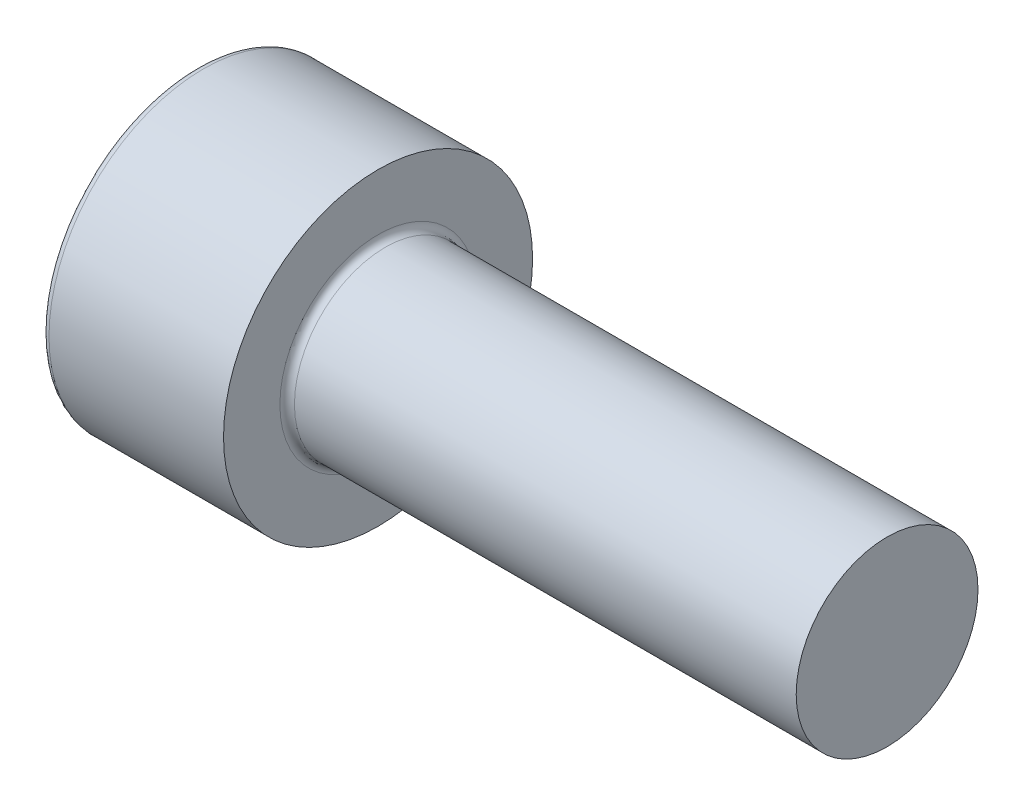
ISO-10303-21;
HEADER;
FILE_DESCRIPTION(('STEP AP214'),'2;1');
FILE_NAME('part.step','',(''),(''),'','','');
FILE_SCHEMA(('AUTOMOTIVE_DESIGN { 1 0 10303 214 1 1 1 1 }'));
ENDSEC;
DATA;
#1=APPLICATION_CONTEXT('core data for automotive mechanical design processes');
#2=APPLICATION_PROTOCOL_DEFINITION('international standard','automotive_design',2000,#1);
#3=PRODUCT_CONTEXT('',#1,'mechanical');
#4=PRODUCT('Part','Part','',(#3));
#5=PRODUCT_RELATED_PRODUCT_CATEGORY('part','',(#4));
#6=PRODUCT_DEFINITION_FORMATION('','',#4);
#7=PRODUCT_DEFINITION_CONTEXT('part definition',#1,'design');
#8=PRODUCT_DEFINITION('design','',#6,#7);
#9=PRODUCT_DEFINITION_SHAPE('','',#8);
#10=(LENGTH_UNIT() NAMED_UNIT(*) SI_UNIT(.MILLI.,.METRE.));
#11=(NAMED_UNIT(*) PLANE_ANGLE_UNIT() SI_UNIT($,.RADIAN.));
#12=(NAMED_UNIT(*) SI_UNIT($,.STERADIAN.) SOLID_ANGLE_UNIT());
#13=UNCERTAINTY_MEASURE_WITH_UNIT(LENGTH_MEASURE(1.E-05),#10,'distance_accuracy_value','');
#14=(GEOMETRIC_REPRESENTATION_CONTEXT(3) GLOBAL_UNCERTAINTY_ASSIGNED_CONTEXT((#13)) GLOBAL_UNIT_ASSIGNED_CONTEXT((#10,
#11,#12)) REPRESENTATION_CONTEXT('',''));
#15=CARTESIAN_POINT('',(0.,0.,0.));
#16=DIRECTION('',(0.,0.,1.));
#17=DIRECTION('',(1.,0.,0.));
#18=AXIS2_PLACEMENT_3D('',#15,#16,#17);
#19=CARTESIAN_POINT('',(0.,0.,0.));
#20=DIRECTION('',(1.,0.,0.));
#21=DIRECTION('',(0.,0.,-1.));
#22=AXIS2_PLACEMENT_3D('',#19,#20,#21);
#23=CYLINDRICAL_SURFACE('',#22,2.5);
#24=CARTESIAN_POINT('',(5.2,0.,0.));
#25=DIRECTION('',(1.,0.,0.));
#26=DIRECTION('',(0.,0.,-1.));
#27=AXIS2_PLACEMENT_3D('',#24,#25,#26);
#28=CIRCLE('',#27,2.5);
#29=CARTESIAN_POINT('',(5.2,0.,-2.5));
#30=VERTEX_POINT('',#29);
#31=EDGE_CURVE('E148',#30,#30,#28,.T.);
#32=ORIENTED_EDGE('',*,*,#31,.T.);
#33=EDGE_LOOP('',(#32));
#34=FACE_BOUND('',#33,.T.);
#35=CARTESIAN_POINT('',(19.,0.,0.));
#36=DIRECTION('',(1.,0.,0.));
#37=DIRECTION('',(0.,0.,-1.));
#38=AXIS2_PLACEMENT_3D('',#35,#36,#37);
#39=CIRCLE('',#38,2.5);
#40=CARTESIAN_POINT('',(19.,0.,-2.5));
#41=VERTEX_POINT('',#40);
#42=EDGE_CURVE('E49',#41,#41,#39,.F.);
#43=ORIENTED_EDGE('',*,*,#42,.T.);
#44=EDGE_LOOP('',(#43));
#45=FACE_BOUND('',#44,.T.);
#46=ADVANCED_FACE('F45',(#34,#45),#23,.T.);
#47=CARTESIAN_POINT('',(0.,0.,0.));
#48=DIRECTION('',(-1.,0.,0.));
#49=DIRECTION('',(0.,0.,1.));
#50=AXIS2_PLACEMENT_3D('',#47,#48,#49);
#51=PLANE('',#50);
#52=CARTESIAN_POINT('',(0.,0.,0.));
#53=DIRECTION('',(-1.,0.,0.));
#54=DIRECTION('',(0.,0.,1.));
#55=AXIS2_PLACEMENT_3D('',#52,#53,#54);
#56=CIRCLE('',#55,4.05);
#57=CARTESIAN_POINT('',(0.,0.,4.05));
#58=VERTEX_POINT('',#57);
#59=EDGE_CURVE('E11',#58,#58,#56,.T.);
#60=ORIENTED_EDGE('',*,*,#59,.T.);
#61=EDGE_LOOP('',(#60));
#62=FACE_BOUND('',#61,.T.);
#63=DIRECTION('',(0.,0.5,0.866025403784439));
#64=VECTOR('',#63,1.);
#65=CARTESIAN_POINT('',(0.,-2.29,0.));
#66=LINE('',#65,#64);
#67=CARTESIAN_POINT('',(0.,-2.29,0.));
#68=VERTEX_POINT('',#67);
#69=CARTESIAN_POINT('',(0.,-1.145,1.98319817466636));
#70=VERTEX_POINT('',#69);
#71=EDGE_CURVE('E61',#68,#70,#66,.T.);
#72=ORIENTED_EDGE('',*,*,#71,.F.);
#73=DIRECTION('',(0.,-0.5,0.866025403784439));
#74=VECTOR('',#73,1.);
#75=CARTESIAN_POINT('',(0.,-1.145,-1.98319817466636));
#76=LINE('',#75,#74);
#77=CARTESIAN_POINT('',(0.,-1.145,-1.98319817466636));
#78=VERTEX_POINT('',#77);
#79=EDGE_CURVE('E144',#78,#68,#76,.T.);
#80=ORIENTED_EDGE('',*,*,#79,.F.);
#81=DIRECTION('',(0.,-1.,0.));
#82=VECTOR('',#81,1.);
#83=CARTESIAN_POINT('',(0.,1.145,-1.98319817466636));
#84=LINE('',#83,#82);
#85=CARTESIAN_POINT('',(0.,1.145,-1.98319817466636));
#86=VERTEX_POINT('',#85);
#87=EDGE_CURVE('E142',#86,#78,#84,.T.);
#88=ORIENTED_EDGE('',*,*,#87,.F.);
#89=DIRECTION('',(0.,-0.5,-0.866025403784439));
#90=VECTOR('',#89,1.);
#91=CARTESIAN_POINT('',(0.,2.29,0.));
#92=LINE('',#91,#90);
#93=CARTESIAN_POINT('',(0.,2.29,0.));
#94=VERTEX_POINT('',#93);
#95=EDGE_CURVE('E109',#94,#86,#92,.T.);
#96=ORIENTED_EDGE('',*,*,#95,.F.);
#97=DIRECTION('',(0.,0.5,-0.866025403784439));
#98=VECTOR('',#97,1.);
#99=CARTESIAN_POINT('',(0.,1.145,1.98319817466636));
#100=LINE('',#99,#98);
#101=CARTESIAN_POINT('',(0.,1.145,1.98319817466636));
#102=VERTEX_POINT('',#101);
#103=EDGE_CURVE('E138',#102,#94,#100,.T.);
#104=ORIENTED_EDGE('',*,*,#103,.F.);
#105=DIRECTION('',(0.,1.,0.));
#106=VECTOR('',#105,1.);
#107=CARTESIAN_POINT('',(0.,-1.145,1.98319817466636));
#108=LINE('',#107,#106);
#109=EDGE_CURVE('E135',#70,#102,#108,.T.);
#110=ORIENTED_EDGE('',*,*,#109,.F.);
#111=EDGE_LOOP('',(#72,#80,#88,#96,#104,#110));
#112=FACE_BOUND('',#111,.T.);
#113=ADVANCED_FACE('F183',(#62,#112),#51,.T.);
#114=CARTESIAN_POINT('',(0.,0.,0.));
#115=DIRECTION('',(1.,0.,0.));
#116=DIRECTION('',(0.,0.,-1.));
#117=AXIS2_PLACEMENT_3D('',#114,#115,#116);
#118=CYLINDRICAL_SURFACE('',#117,4.25);
#119=CARTESIAN_POINT('',(0.2,0.,0.));
#120=DIRECTION('',(-1.,0.,0.));
#121=DIRECTION('',(0.,0.,1.));
#122=AXIS2_PLACEMENT_3D('',#119,#120,#121);
#123=CIRCLE('',#122,4.25);
#124=CARTESIAN_POINT('',(0.2,0.,4.25));
#125=VERTEX_POINT('',#124);
#126=EDGE_CURVE('E54',#125,#125,#123,.F.);
#127=ORIENTED_EDGE('',*,*,#126,.T.);
#128=EDGE_LOOP('',(#127));
#129=FACE_BOUND('',#128,.T.);
#130=CARTESIAN_POINT('',(5.,0.,0.));
#131=DIRECTION('',(1.,0.,0.));
#132=DIRECTION('',(0.,0.,-1.));
#133=AXIS2_PLACEMENT_3D('',#130,#131,#132);
#134=CIRCLE('',#133,4.25);
#135=CARTESIAN_POINT('',(5.,0.,-4.25));
#136=VERTEX_POINT('',#135);
#137=EDGE_CURVE('E159',#136,#136,#134,.T.);
#138=ORIENTED_EDGE('',*,*,#137,.F.);
#139=EDGE_LOOP('',(#138));
#140=FACE_BOUND('',#139,.T.);
#141=ADVANCED_FACE('F166',(#129,#140),#118,.T.);
#142=CARTESIAN_POINT('',(5.,4.25,0.));
#143=DIRECTION('',(1.,0.,0.));
#144=DIRECTION('',(0.,0.,-1.));
#145=AXIS2_PLACEMENT_3D('',#142,#143,#144);
#146=PLANE('',#145);
#147=ORIENTED_EDGE('',*,*,#137,.T.);
#148=EDGE_LOOP('',(#147));
#149=FACE_BOUND('',#148,.T.);
#150=CARTESIAN_POINT('',(5.,0.,0.));
#151=DIRECTION('',(1.,0.,0.));
#152=DIRECTION('',(0.,0.,-1.));
#153=AXIS2_PLACEMENT_3D('',#150,#151,#152);
#154=CIRCLE('',#153,2.7);
#155=CARTESIAN_POINT('',(5.,0.,-2.7));
#156=VERTEX_POINT('',#155);
#157=EDGE_CURVE('E156',#156,#156,#154,.T.);
#158=ORIENTED_EDGE('',*,*,#157,.F.);
#159=EDGE_LOOP('',(#158));
#160=FACE_BOUND('',#159,.T.);
#161=ADVANCED_FACE('F198',(#149,#160),#146,.T.);
#162=CARTESIAN_POINT('',(5.2,0.,0.));
#163=DIRECTION('',(1.,0.,0.));
#164=DIRECTION('',(0.,0.,-1.));
#165=AXIS2_PLACEMENT_3D('',#162,#163,#164);
#166=TOROIDAL_SURFACE('',#165,2.7,0.2);
#167=ORIENTED_EDGE('',*,*,#157,.T.);
#168=EDGE_LOOP('',(#167));
#169=FACE_BOUND('',#168,.T.);
#170=ORIENTED_EDGE('',*,*,#31,.F.);
#171=EDGE_LOOP('',(#170));
#172=FACE_BOUND('',#171,.T.);
#173=ADVANCED_FACE('F195',(#169,#172),#166,.F.);
#174=CARTESIAN_POINT('',(2.5,-2.29,0.));
#175=DIRECTION('',(0.,-0.866025403784439,0.5));
#176=DIRECTION('',(0.,-0.5,-0.866025403784439));
#177=AXIS2_PLACEMENT_3D('',#174,#175,#176);
#178=PLANE('',#177);
#179=ORIENTED_EDGE('',*,*,#71,.T.);
#180=DIRECTION('',(-1.,0.,0.));
#181=VECTOR('',#180,1.);
#182=CARTESIAN_POINT('',(2.5,-1.145,1.98319817466636));
#183=LINE('',#182,#181);
#184=CARTESIAN_POINT('',(2.5,-1.145,1.98319817466636));
#185=VERTEX_POINT('',#184);
#186=EDGE_CURVE('E91',#185,#70,#183,.T.);
#187=ORIENTED_EDGE('',*,*,#186,.F.);
#188=DIRECTION('',(0.,0.5,0.866025403784439));
#189=VECTOR('',#188,1.);
#190=CARTESIAN_POINT('',(2.5,-2.29,0.));
#191=LINE('',#190,#189);
#192=CARTESIAN_POINT('',(2.5,-2.29,0.));
#193=VERTEX_POINT('',#192);
#194=EDGE_CURVE('E146',#193,#185,#191,.T.);
#195=ORIENTED_EDGE('',*,*,#194,.F.);
#196=DIRECTION('',(-1.,0.,0.));
#197=VECTOR('',#196,1.);
#198=CARTESIAN_POINT('',(2.5,-2.29,0.));
#199=LINE('',#198,#197);
#200=EDGE_CURVE('E69',#193,#68,#199,.T.);
#201=ORIENTED_EDGE('',*,*,#200,.T.);
#202=EDGE_LOOP('',(#179,#187,#195,#201));
#203=FACE_BOUND('',#202,.T.);
#204=ADVANCED_FACE('F193',(#203),#178,.F.);
#205=CARTESIAN_POINT('',(2.5,-1.145,-1.98319817466636));
#206=DIRECTION('',(0.,-0.866025403784439,-0.5));
#207=DIRECTION('',(0.,0.5,-0.866025403784439));
#208=AXIS2_PLACEMENT_3D('',#205,#206,#207);
#209=PLANE('',#208);
#210=ORIENTED_EDGE('',*,*,#79,.T.);
#211=ORIENTED_EDGE('',*,*,#200,.F.);
#212=DIRECTION('',(0.,-0.5,0.866025403784439));
#213=VECTOR('',#212,1.);
#214=CARTESIAN_POINT('',(2.5,-1.145,-1.98319817466636));
#215=LINE('',#214,#213);
#216=CARTESIAN_POINT('',(2.5,-1.145,-1.98319817466636));
#217=VERTEX_POINT('',#216);
#218=EDGE_CURVE('E121',#217,#193,#215,.T.);
#219=ORIENTED_EDGE('',*,*,#218,.F.);
#220=DIRECTION('',(-1.,0.,0.));
#221=VECTOR('',#220,1.);
#222=CARTESIAN_POINT('',(2.5,-1.145,-1.98319817466636));
#223=LINE('',#222,#221);
#224=EDGE_CURVE('E113',#217,#78,#223,.T.);
#225=ORIENTED_EDGE('',*,*,#224,.T.);
#226=EDGE_LOOP('',(#210,#211,#219,#225));
#227=FACE_BOUND('',#226,.T.);
#228=ADVANCED_FACE('F222',(#227),#209,.F.);
#229=CARTESIAN_POINT('',(2.5,1.145,-1.98319817466636));
#230=DIRECTION('',(0.,0.,-1.));
#231=DIRECTION('',(0.,1.,0.));
#232=AXIS2_PLACEMENT_3D('',#229,#230,#231);
#233=PLANE('',#232);
#234=ORIENTED_EDGE('',*,*,#87,.T.);
#235=ORIENTED_EDGE('',*,*,#224,.F.);
#236=DIRECTION('',(0.,-1.,0.));
#237=VECTOR('',#236,1.);
#238=CARTESIAN_POINT('',(2.5,1.145,-1.98319817466636));
#239=LINE('',#238,#237);
#240=CARTESIAN_POINT('',(2.5,1.145,-1.98319817466636));
#241=VERTEX_POINT('',#240);
#242=EDGE_CURVE('E117',#241,#217,#239,.T.);
#243=ORIENTED_EDGE('',*,*,#242,.F.);
#244=DIRECTION('',(-1.,0.,0.));
#245=VECTOR('',#244,1.);
#246=CARTESIAN_POINT('',(2.5,1.145,-1.98319817466636));
#247=LINE('',#246,#245);
#248=EDGE_CURVE('E102',#241,#86,#247,.T.);
#249=ORIENTED_EDGE('',*,*,#248,.T.);
#250=EDGE_LOOP('',(#234,#235,#243,#249));
#251=FACE_BOUND('',#250,.T.);
#252=ADVANCED_FACE('F118',(#251),#233,.F.);
#253=CARTESIAN_POINT('',(2.5,2.29,0.));
#254=DIRECTION('',(0.,0.866025403784439,-0.5));
#255=DIRECTION('',(0.,0.5,0.866025403784439));
#256=AXIS2_PLACEMENT_3D('',#253,#254,#255);
#257=PLANE('',#256);
#258=ORIENTED_EDGE('',*,*,#95,.T.);
#259=ORIENTED_EDGE('',*,*,#248,.F.);
#260=DIRECTION('',(0.,-0.5,-0.866025403784439));
#261=VECTOR('',#260,1.);
#262=CARTESIAN_POINT('',(2.5,2.29,0.));
#263=LINE('',#262,#261);
#264=CARTESIAN_POINT('',(2.5,2.29,0.));
#265=VERTEX_POINT('',#264);
#266=EDGE_CURVE('E106',#265,#241,#263,.T.);
#267=ORIENTED_EDGE('',*,*,#266,.F.);
#268=DIRECTION('',(-1.,0.,0.));
#269=VECTOR('',#268,1.);
#270=CARTESIAN_POINT('',(2.5,2.29,0.));
#271=LINE('',#270,#269);
#272=EDGE_CURVE('E114',#265,#94,#271,.T.);
#273=ORIENTED_EDGE('',*,*,#272,.T.);
#274=EDGE_LOOP('',(#258,#259,#267,#273));
#275=FACE_BOUND('',#274,.T.);
#276=ADVANCED_FACE('F104',(#275),#257,.F.);
#277=CARTESIAN_POINT('',(2.5,1.145,1.98319817466636));
#278=DIRECTION('',(0.,0.866025403784439,0.5));
#279=DIRECTION('',(0.,-0.5,0.866025403784439));
#280=AXIS2_PLACEMENT_3D('',#277,#278,#279);
#281=PLANE('',#280);
#282=ORIENTED_EDGE('',*,*,#103,.T.);
#283=ORIENTED_EDGE('',*,*,#272,.F.);
#284=DIRECTION('',(0.,0.5,-0.866025403784439));
#285=VECTOR('',#284,1.);
#286=CARTESIAN_POINT('',(2.5,1.145,1.98319817466636));
#287=LINE('',#286,#285);
#288=CARTESIAN_POINT('',(2.5,1.145,1.98319817466636));
#289=VERTEX_POINT('',#288);
#290=EDGE_CURVE('E127',#289,#265,#287,.T.);
#291=ORIENTED_EDGE('',*,*,#290,.F.);
#292=DIRECTION('',(-1.,0.,0.));
#293=VECTOR('',#292,1.);
#294=CARTESIAN_POINT('',(2.5,1.145,1.98319817466636));
#295=LINE('',#294,#293);
#296=EDGE_CURVE('E151',#289,#102,#295,.T.);
#297=ORIENTED_EDGE('',*,*,#296,.T.);
#298=EDGE_LOOP('',(#282,#283,#291,#297));
#299=FACE_BOUND('',#298,.T.);
#300=ADVANCED_FACE('F240',(#299),#281,.F.);
#301=CARTESIAN_POINT('',(2.5,-1.145,1.98319817466636));
#302=DIRECTION('',(0.,0.,1.));
#303=DIRECTION('',(0.,-1.,0.));
#304=AXIS2_PLACEMENT_3D('',#301,#302,#303);
#305=PLANE('',#304);
#306=ORIENTED_EDGE('',*,*,#109,.T.);
#307=ORIENTED_EDGE('',*,*,#296,.F.);
#308=DIRECTION('',(0.,1.,0.));
#309=VECTOR('',#308,1.);
#310=CARTESIAN_POINT('',(2.5,-1.145,1.98319817466636));
#311=LINE('',#310,#309);
#312=EDGE_CURVE('E129',#185,#289,#311,.T.);
#313=ORIENTED_EDGE('',*,*,#312,.F.);
#314=ORIENTED_EDGE('',*,*,#186,.T.);
#315=EDGE_LOOP('',(#306,#307,#313,#314));
#316=FACE_BOUND('',#315,.T.);
#317=ADVANCED_FACE('F179',(#316),#305,.F.);
#318=CARTESIAN_POINT('',(2.5,-1.145,1.98319817466636));
#319=DIRECTION('',(-1.,0.,0.));
#320=DIRECTION('',(0.,0.,1.));
#321=AXIS2_PLACEMENT_3D('',#318,#319,#320);
#322=PLANE('',#321);
#323=ORIENTED_EDGE('',*,*,#194,.T.);
#324=ORIENTED_EDGE('',*,*,#312,.T.);
#325=ORIENTED_EDGE('',*,*,#290,.T.);
#326=ORIENTED_EDGE('',*,*,#266,.T.);
#327=ORIENTED_EDGE('',*,*,#242,.T.);
#328=ORIENTED_EDGE('',*,*,#218,.T.);
#329=EDGE_LOOP('',(#323,#324,#325,#326,#327,#328));
#330=FACE_BOUND('',#329,.T.);
#331=ADVANCED_FACE('F124',(#330),#322,.T.);
#332=CARTESIAN_POINT('',(0.2,0.,0.));
#333=DIRECTION('',(-1.,0.,0.));
#334=DIRECTION('',(0.,0.,1.));
#335=AXIS2_PLACEMENT_3D('',#332,#333,#334);
#336=TOROIDAL_SURFACE('',#335,4.05,0.2);
#337=ORIENTED_EDGE('',*,*,#59,.F.);
#338=EDGE_LOOP('',(#337));
#339=FACE_BOUND('',#338,.T.);
#340=ORIENTED_EDGE('',*,*,#126,.F.);
#341=EDGE_LOOP('',(#340));
#342=FACE_BOUND('',#341,.T.);
#343=ADVANCED_FACE('F47',(#339,#342),#336,.T.);
#344=CARTESIAN_POINT('',(19.,0.,0.));
#345=DIRECTION('',(1.,0.,0.));
#346=DIRECTION('',(0.,0.,-1.));
#347=AXIS2_PLACEMENT_3D('',#344,#345,#346);
#348=PLANE('',#347);
#349=ORIENTED_EDGE('',*,*,#42,.F.);
#350=EDGE_LOOP('',(#349));
#351=FACE_BOUND('',#350,.T.);
#352=ADVANCED_FACE('F170',(#351),#348,.T.);
#353=CLOSED_SHELL('',(#46,#113,#141,#161,#173,#204,#228,#252,#276,#300,#317,#331,#343,#352));
#354=MANIFOLD_SOLID_BREP('B2',#353);
#355=ADVANCED_BREP_SHAPE_REPRESENTATION('',(#18,#354),#14);
#356=SHAPE_DEFINITION_REPRESENTATION(#9,#355);
ENDSEC;
END-ISO-10303-21;
